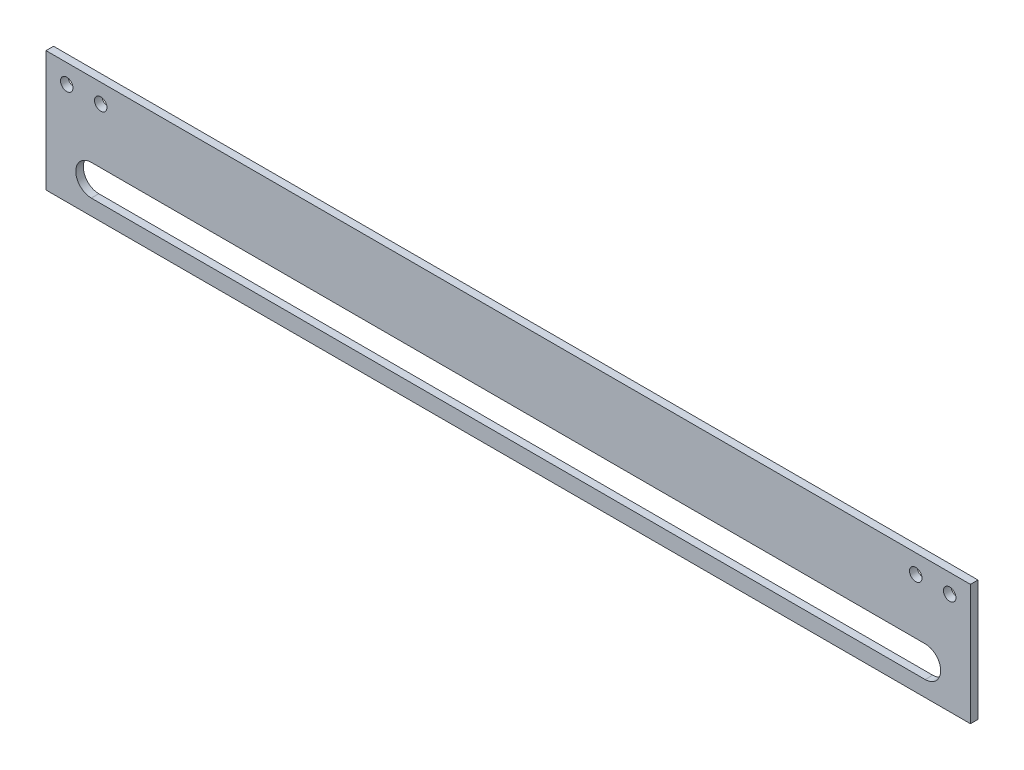
ISO-10303-21;
HEADER;
FILE_DESCRIPTION(('STEP AP214'),'2;1');
FILE_NAME('part.step','',(''),(''),'','','');
FILE_SCHEMA(('AUTOMOTIVE_DESIGN { 1 0 10303 214 1 1 1 1 }'));
ENDSEC;
DATA;
#1=APPLICATION_CONTEXT('core data for automotive mechanical design processes');
#2=APPLICATION_PROTOCOL_DEFINITION('international standard','automotive_design',2000,#1);
#3=PRODUCT_CONTEXT('',#1,'mechanical');
#4=PRODUCT('Part','Part','',(#3));
#5=PRODUCT_RELATED_PRODUCT_CATEGORY('part','',(#4));
#6=PRODUCT_DEFINITION_FORMATION('','',#4);
#7=PRODUCT_DEFINITION_CONTEXT('part definition',#1,'design');
#8=PRODUCT_DEFINITION('design','',#6,#7);
#9=PRODUCT_DEFINITION_SHAPE('','',#8);
#10=(LENGTH_UNIT() NAMED_UNIT(*) SI_UNIT(.MILLI.,.METRE.));
#11=(NAMED_UNIT(*) PLANE_ANGLE_UNIT() SI_UNIT($,.RADIAN.));
#12=(NAMED_UNIT(*) SI_UNIT($,.STERADIAN.) SOLID_ANGLE_UNIT());
#13=UNCERTAINTY_MEASURE_WITH_UNIT(LENGTH_MEASURE(1.E-05),#10,'distance_accuracy_value','');
#14=(GEOMETRIC_REPRESENTATION_CONTEXT(3) GLOBAL_UNCERTAINTY_ASSIGNED_CONTEXT((#13)) GLOBAL_UNIT_ASSIGNED_CONTEXT((#10,
#11,#12)) REPRESENTATION_CONTEXT('',''));
#15=CARTESIAN_POINT('',(0.,0.,0.));
#16=DIRECTION('',(0.,0.,1.));
#17=DIRECTION('',(1.,0.,0.));
#18=AXIS2_PLACEMENT_3D('',#15,#16,#17);
#19=CARTESIAN_POINT('',(0.,0.,2.));
#20=DIRECTION('',(0.,1.,0.));
#21=DIRECTION('',(-1.,0.,0.));
#22=AXIS2_PLACEMENT_3D('',#19,#20,#21);
#23=PLANE('',#22);
#24=DIRECTION('',(1.,0.,0.));
#25=VECTOR('',#24,1.);
#26=CARTESIAN_POINT('',(0.,0.,0.));
#27=LINE('',#26,#25);
#28=CARTESIAN_POINT('',(0.,0.,0.));
#29=VERTEX_POINT('',#28);
#30=CARTESIAN_POINT('',(245.,0.,0.));
#31=VERTEX_POINT('',#30);
#32=EDGE_CURVE('E157',#29,#31,#27,.T.);
#33=ORIENTED_EDGE('',*,*,#32,.T.);
#34=DIRECTION('',(0.,0.,-1.));
#35=VECTOR('',#34,1.);
#36=CARTESIAN_POINT('',(245.,0.,2.));
#37=LINE('',#36,#35);
#38=CARTESIAN_POINT('',(245.,0.,2.));
#39=VERTEX_POINT('',#38);
#40=EDGE_CURVE('E11',#39,#31,#37,.T.);
#41=ORIENTED_EDGE('',*,*,#40,.F.);
#42=DIRECTION('',(1.,0.,0.));
#43=VECTOR('',#42,1.);
#44=CARTESIAN_POINT('',(0.,0.,2.));
#45=LINE('',#44,#43);
#46=CARTESIAN_POINT('',(0.,0.,2.));
#47=VERTEX_POINT('',#46);
#48=EDGE_CURVE('E116',#47,#39,#45,.T.);
#49=ORIENTED_EDGE('',*,*,#48,.F.);
#50=DIRECTION('',(0.,0.,-1.));
#51=VECTOR('',#50,1.);
#52=CARTESIAN_POINT('',(0.,0.,2.));
#53=LINE('',#52,#51);
#54=EDGE_CURVE('E55',#47,#29,#53,.T.);
#55=ORIENTED_EDGE('',*,*,#54,.T.);
#56=EDGE_LOOP('',(#33,#41,#49,#55));
#57=FACE_BOUND('',#56,.T.);
#58=ADVANCED_FACE('F36',(#57),#23,.F.);
#59=CARTESIAN_POINT('',(245.,0.,2.));
#60=DIRECTION('',(-1.,0.,0.));
#61=DIRECTION('',(0.,0.,1.));
#62=AXIS2_PLACEMENT_3D('',#59,#60,#61);
#63=PLANE('',#62);
#64=DIRECTION('',(0.,1.,0.));
#65=VECTOR('',#64,1.);
#66=CARTESIAN_POINT('',(245.,0.,0.));
#67=LINE('',#66,#65);
#68=CARTESIAN_POINT('',(245.,32.,0.));
#69=VERTEX_POINT('',#68);
#70=EDGE_CURVE('E122',#31,#69,#67,.T.);
#71=ORIENTED_EDGE('',*,*,#70,.T.);
#72=DIRECTION('',(0.,0.,-1.));
#73=VECTOR('',#72,1.);
#74=CARTESIAN_POINT('',(245.,32.,2.));
#75=LINE('',#74,#73);
#76=CARTESIAN_POINT('',(245.,32.,2.));
#77=VERTEX_POINT('',#76);
#78=EDGE_CURVE('E46',#77,#69,#75,.T.);
#79=ORIENTED_EDGE('',*,*,#78,.F.);
#80=DIRECTION('',(0.,1.,0.));
#81=VECTOR('',#80,1.);
#82=CARTESIAN_POINT('',(245.,0.,2.));
#83=LINE('',#82,#81);
#84=EDGE_CURVE('E109',#39,#77,#83,.T.);
#85=ORIENTED_EDGE('',*,*,#84,.F.);
#86=ORIENTED_EDGE('',*,*,#40,.T.);
#87=EDGE_LOOP('',(#71,#79,#85,#86));
#88=FACE_BOUND('',#87,.T.);
#89=ADVANCED_FACE('F121',(#88),#63,.F.);
#90=CARTESIAN_POINT('',(0.,32.,2.));
#91=DIRECTION('',(0.,1.,0.));
#92=DIRECTION('',(0.,0.,1.));
#93=AXIS2_PLACEMENT_3D('',#90,#91,#92);
#94=PLANE('',#93);
#95=DIRECTION('',(1.,0.,0.));
#96=VECTOR('',#95,1.);
#97=CARTESIAN_POINT('',(0.,32.,0.));
#98=LINE('',#97,#96);
#99=CARTESIAN_POINT('',(0.,32.,0.));
#100=VERTEX_POINT('',#99);
#101=EDGE_CURVE('E160',#100,#69,#98,.T.);
#102=ORIENTED_EDGE('',*,*,#101,.F.);
#103=DIRECTION('',(0.,0.,-1.));
#104=VECTOR('',#103,1.);
#105=CARTESIAN_POINT('',(0.,32.,2.));
#106=LINE('',#105,#104);
#107=CARTESIAN_POINT('',(0.,32.,2.));
#108=VERTEX_POINT('',#107);
#109=EDGE_CURVE('E81',#108,#100,#106,.T.);
#110=ORIENTED_EDGE('',*,*,#109,.F.);
#111=DIRECTION('',(1.,0.,0.));
#112=VECTOR('',#111,1.);
#113=CARTESIAN_POINT('',(0.,32.,2.));
#114=LINE('',#113,#112);
#115=EDGE_CURVE('E115',#108,#77,#114,.T.);
#116=ORIENTED_EDGE('',*,*,#115,.T.);
#117=ORIENTED_EDGE('',*,*,#78,.T.);
#118=EDGE_LOOP('',(#102,#110,#116,#117));
#119=FACE_BOUND('',#118,.T.);
#120=ADVANCED_FACE('F126',(#119),#94,.T.);
#121=CARTESIAN_POINT('',(233.,8.25000000000003,2.));
#122=DIRECTION('',(0.,0.,-1.));
#123=DIRECTION('',(-1.,0.,0.));
#124=AXIS2_PLACEMENT_3D('',#121,#122,#123);
#125=CYLINDRICAL_SURFACE('',#124,4.1);
#126=CARTESIAN_POINT('',(233.,8.25000000000003,0.));
#127=DIRECTION('',(0.,0.,1.));
#128=DIRECTION('',(1.,0.,0.));
#129=AXIS2_PLACEMENT_3D('',#126,#127,#128);
#130=CIRCLE('',#129,4.1);
#131=CARTESIAN_POINT('',(233.,4.15000000000003,0.));
#132=VERTEX_POINT('',#131);
#133=CARTESIAN_POINT('',(233.,12.35,0.));
#134=VERTEX_POINT('',#133);
#135=EDGE_CURVE('E145',#132,#134,#130,.T.);
#136=ORIENTED_EDGE('',*,*,#135,.F.);
#137=DIRECTION('',(0.,0.,-1.));
#138=VECTOR('',#137,1.);
#139=CARTESIAN_POINT('',(233.,4.15000000000003,2.));
#140=LINE('',#139,#138);
#141=CARTESIAN_POINT('',(233.,4.15000000000003,2.));
#142=VERTEX_POINT('',#141);
#143=EDGE_CURVE('E40',#142,#132,#140,.T.);
#144=ORIENTED_EDGE('',*,*,#143,.F.);
#145=CARTESIAN_POINT('',(233.,8.25000000000003,2.));
#146=DIRECTION('',(0.,0.,1.));
#147=DIRECTION('',(1.,0.,0.));
#148=AXIS2_PLACEMENT_3D('',#145,#146,#147);
#149=CIRCLE('',#148,4.1);
#150=CARTESIAN_POINT('',(233.,12.35,2.));
#151=VERTEX_POINT('',#150);
#152=EDGE_CURVE('E199',#142,#151,#149,.T.);
#153=ORIENTED_EDGE('',*,*,#152,.T.);
#154=DIRECTION('',(0.,0.,-1.));
#155=VECTOR('',#154,1.);
#156=CARTESIAN_POINT('',(233.,12.35,2.));
#157=LINE('',#156,#155);
#158=EDGE_CURVE('E135',#151,#134,#157,.T.);
#159=ORIENTED_EDGE('',*,*,#158,.T.);
#160=EDGE_LOOP('',(#136,#144,#153,#159));
#161=FACE_BOUND('',#160,.T.);
#162=ADVANCED_FACE('F183',(#161),#125,.F.);
#163=CARTESIAN_POINT('',(0.,4.15,2.));
#164=DIRECTION('',(0.,1.,0.));
#165=DIRECTION('',(-1.,0.,0.));
#166=AXIS2_PLACEMENT_3D('',#163,#164,#165);
#167=PLANE('',#166);
#168=DIRECTION('',(1.,0.,0.));
#169=VECTOR('',#168,1.);
#170=CARTESIAN_POINT('',(0.,4.15,0.));
#171=LINE('',#170,#169);
#172=CARTESIAN_POINT('',(12.,4.15,0.));
#173=VERTEX_POINT('',#172);
#174=EDGE_CURVE('E148',#173,#132,#171,.T.);
#175=ORIENTED_EDGE('',*,*,#174,.F.);
#176=DIRECTION('',(0.,0.,-1.));
#177=VECTOR('',#176,1.);
#178=CARTESIAN_POINT('',(12.,4.15,2.));
#179=LINE('',#178,#177);
#180=CARTESIAN_POINT('',(12.,4.15,2.));
#181=VERTEX_POINT('',#180);
#182=EDGE_CURVE('E173',#181,#173,#179,.T.);
#183=ORIENTED_EDGE('',*,*,#182,.F.);
#184=DIRECTION('',(1.,0.,0.));
#185=VECTOR('',#184,1.);
#186=CARTESIAN_POINT('',(0.,4.15,2.));
#187=LINE('',#186,#185);
#188=EDGE_CURVE('E182',#181,#142,#187,.T.);
#189=ORIENTED_EDGE('',*,*,#188,.T.);
#190=ORIENTED_EDGE('',*,*,#143,.T.);
#191=EDGE_LOOP('',(#175,#183,#189,#190));
#192=FACE_BOUND('',#191,.T.);
#193=ADVANCED_FACE('F180',(#192),#167,.T.);
#194=CARTESIAN_POINT('',(12.,8.25,2.));
#195=DIRECTION('',(0.,0.,-1.));
#196=DIRECTION('',(-1.,0.,0.));
#197=AXIS2_PLACEMENT_3D('',#194,#195,#196);
#198=CYLINDRICAL_SURFACE('',#197,4.1);
#199=CARTESIAN_POINT('',(12.,8.25,0.));
#200=DIRECTION('',(0.,0.,1.));
#201=DIRECTION('',(1.,0.,0.));
#202=AXIS2_PLACEMENT_3D('',#199,#200,#201);
#203=CIRCLE('',#202,4.1);
#204=CARTESIAN_POINT('',(12.,12.35,0.));
#205=VERTEX_POINT('',#204);
#206=EDGE_CURVE('E151',#205,#173,#203,.T.);
#207=ORIENTED_EDGE('',*,*,#206,.F.);
#208=DIRECTION('',(0.,0.,-1.));
#209=VECTOR('',#208,1.);
#210=CARTESIAN_POINT('',(12.,12.35,2.));
#211=LINE('',#210,#209);
#212=CARTESIAN_POINT('',(12.,12.35,2.));
#213=VERTEX_POINT('',#212);
#214=EDGE_CURVE('E172',#213,#205,#211,.T.);
#215=ORIENTED_EDGE('',*,*,#214,.F.);
#216=CARTESIAN_POINT('',(12.,8.25,2.));
#217=DIRECTION('',(0.,0.,1.));
#218=DIRECTION('',(1.,0.,0.));
#219=AXIS2_PLACEMENT_3D('',#216,#217,#218);
#220=CIRCLE('',#219,4.1);
#221=EDGE_CURVE('E192',#213,#181,#220,.T.);
#222=ORIENTED_EDGE('',*,*,#221,.T.);
#223=ORIENTED_EDGE('',*,*,#182,.T.);
#224=EDGE_LOOP('',(#207,#215,#222,#223));
#225=FACE_BOUND('',#224,.T.);
#226=ADVANCED_FACE('F189',(#225),#198,.F.);
#227=CARTESIAN_POINT('',(0.,0.,2.));
#228=DIRECTION('',(-1.,0.,0.));
#229=DIRECTION('',(0.,0.,1.));
#230=AXIS2_PLACEMENT_3D('',#227,#228,#229);
#231=PLANE('',#230);
#232=DIRECTION('',(0.,1.,0.));
#233=VECTOR('',#232,1.);
#234=CARTESIAN_POINT('',(0.,0.,0.));
#235=LINE('',#234,#233);
#236=EDGE_CURVE('E162',#29,#100,#235,.T.);
#237=ORIENTED_EDGE('',*,*,#236,.F.);
#238=ORIENTED_EDGE('',*,*,#54,.F.);
#239=DIRECTION('',(0.,1.,0.));
#240=VECTOR('',#239,1.);
#241=CARTESIAN_POINT('',(0.,0.,2.));
#242=LINE('',#241,#240);
#243=EDGE_CURVE('E127',#47,#108,#242,.T.);
#244=ORIENTED_EDGE('',*,*,#243,.T.);
#245=ORIENTED_EDGE('',*,*,#109,.T.);
#246=EDGE_LOOP('',(#237,#238,#244,#245));
#247=FACE_BOUND('',#246,.T.);
#248=ADVANCED_FACE('F236',(#247),#231,.T.);
#249=CARTESIAN_POINT('',(0.,12.35,2.));
#250=DIRECTION('',(0.,1.,0.));
#251=DIRECTION('',(-1.,0.,0.));
#252=AXIS2_PLACEMENT_3D('',#249,#250,#251);
#253=PLANE('',#252);
#254=DIRECTION('',(1.,0.,0.));
#255=VECTOR('',#254,1.);
#256=CARTESIAN_POINT('',(0.,12.35,0.));
#257=LINE('',#256,#255);
#258=EDGE_CURVE('E154',#205,#134,#257,.T.);
#259=ORIENTED_EDGE('',*,*,#258,.T.);
#260=ORIENTED_EDGE('',*,*,#158,.F.);
#261=DIRECTION('',(1.,0.,0.));
#262=VECTOR('',#261,1.);
#263=CARTESIAN_POINT('',(0.,12.35,2.));
#264=LINE('',#263,#262);
#265=EDGE_CURVE('E194',#213,#151,#264,.T.);
#266=ORIENTED_EDGE('',*,*,#265,.F.);
#267=ORIENTED_EDGE('',*,*,#214,.T.);
#268=EDGE_LOOP('',(#259,#260,#266,#267));
#269=FACE_BOUND('',#268,.T.);
#270=ADVANCED_FACE('F195',(#269),#253,.F.);
#271=CARTESIAN_POINT('',(14.5,27.,2.));
#272=DIRECTION('',(0.,0.,-1.));
#273=DIRECTION('',(-1.,0.,0.));
#274=AXIS2_PLACEMENT_3D('',#271,#272,#273);
#275=CYLINDRICAL_SURFACE('',#274,1.65);
#276=CARTESIAN_POINT('',(14.5,27.,2.));
#277=DIRECTION('',(0.,0.,1.));
#278=DIRECTION('',(1.,0.,0.));
#279=AXIS2_PLACEMENT_3D('',#276,#277,#278);
#280=CIRCLE('',#279,1.65);
#281=CARTESIAN_POINT('',(16.15,27.,2.));
#282=VERTEX_POINT('',#281);
#283=EDGE_CURVE('E203',#282,#282,#280,.T.);
#284=ORIENTED_EDGE('',*,*,#283,.T.);
#285=EDGE_LOOP('',(#284));
#286=FACE_BOUND('',#285,.T.);
#287=CARTESIAN_POINT('',(14.5,27.,0.));
#288=DIRECTION('',(0.,0.,1.));
#289=DIRECTION('',(1.,0.,0.));
#290=AXIS2_PLACEMENT_3D('',#287,#288,#289);
#291=CIRCLE('',#290,1.65);
#292=CARTESIAN_POINT('',(16.15,27.,0.));
#293=VERTEX_POINT('',#292);
#294=EDGE_CURVE('E142',#293,#293,#291,.T.);
#295=ORIENTED_EDGE('',*,*,#294,.F.);
#296=EDGE_LOOP('',(#295));
#297=FACE_BOUND('',#296,.T.);
#298=ADVANCED_FACE('F227',(#286,#297),#275,.F.);
#299=CARTESIAN_POINT('',(5.5,27.,2.));
#300=DIRECTION('',(0.,0.,-1.));
#301=DIRECTION('',(-1.,0.,0.));
#302=AXIS2_PLACEMENT_3D('',#299,#300,#301);
#303=CYLINDRICAL_SURFACE('',#302,1.65);
#304=CARTESIAN_POINT('',(5.5,27.,2.));
#305=DIRECTION('',(0.,0.,1.));
#306=DIRECTION('',(1.,0.,0.));
#307=AXIS2_PLACEMENT_3D('',#304,#305,#306);
#308=CIRCLE('',#307,1.65);
#309=CARTESIAN_POINT('',(7.15,27.,2.));
#310=VERTEX_POINT('',#309);
#311=EDGE_CURVE('E206',#310,#310,#308,.T.);
#312=ORIENTED_EDGE('',*,*,#311,.T.);
#313=EDGE_LOOP('',(#312));
#314=FACE_BOUND('',#313,.T.);
#315=CARTESIAN_POINT('',(5.5,27.,0.));
#316=DIRECTION('',(0.,0.,1.));
#317=DIRECTION('',(1.,0.,0.));
#318=AXIS2_PLACEMENT_3D('',#315,#316,#317);
#319=CIRCLE('',#318,1.65);
#320=CARTESIAN_POINT('',(7.15,27.,0.));
#321=VERTEX_POINT('',#320);
#322=EDGE_CURVE('E139',#321,#321,#319,.T.);
#323=ORIENTED_EDGE('',*,*,#322,.F.);
#324=EDGE_LOOP('',(#323));
#325=FACE_BOUND('',#324,.T.);
#326=ADVANCED_FACE('F217',(#314,#325),#303,.F.);
#327=CARTESIAN_POINT('',(230.5,27.,2.));
#328=DIRECTION('',(0.,0.,-1.));
#329=DIRECTION('',(-1.,0.,0.));
#330=AXIS2_PLACEMENT_3D('',#327,#328,#329);
#331=CYLINDRICAL_SURFACE('',#330,1.65000000000002);
#332=CARTESIAN_POINT('',(230.5,27.,2.));
#333=DIRECTION('',(0.,0.,1.));
#334=DIRECTION('',(1.,0.,0.));
#335=AXIS2_PLACEMENT_3D('',#332,#333,#334);
#336=CIRCLE('',#335,1.65000000000002);
#337=CARTESIAN_POINT('',(232.15,27.,2.));
#338=VERTEX_POINT('',#337);
#339=EDGE_CURVE('E168',#338,#338,#336,.F.);
#340=ORIENTED_EDGE('',*,*,#339,.F.);
#341=EDGE_LOOP('',(#340));
#342=FACE_BOUND('',#341,.T.);
#343=CARTESIAN_POINT('',(230.5,27.,0.));
#344=DIRECTION('',(0.,0.,1.));
#345=DIRECTION('',(1.,0.,0.));
#346=AXIS2_PLACEMENT_3D('',#343,#344,#345);
#347=CIRCLE('',#346,1.65000000000002);
#348=CARTESIAN_POINT('',(232.15,27.,0.));
#349=VERTEX_POINT('',#348);
#350=EDGE_CURVE('E136',#349,#349,#347,.F.);
#351=ORIENTED_EDGE('',*,*,#350,.T.);
#352=EDGE_LOOP('',(#351));
#353=FACE_BOUND('',#352,.T.);
#354=ADVANCED_FACE('F38',(#342,#353),#331,.F.);
#355=CARTESIAN_POINT('',(239.5,27.,2.));
#356=DIRECTION('',(0.,0.,-1.));
#357=DIRECTION('',(-1.,0.,0.));
#358=AXIS2_PLACEMENT_3D('',#355,#356,#357);
#359=CYLINDRICAL_SURFACE('',#358,1.64999999999999);
#360=CARTESIAN_POINT('',(239.5,27.,2.));
#361=DIRECTION('',(0.,0.,1.));
#362=DIRECTION('',(1.,0.,0.));
#363=AXIS2_PLACEMENT_3D('',#360,#361,#362);
#364=CIRCLE('',#363,1.64999999999999);
#365=CARTESIAN_POINT('',(241.15,27.,2.));
#366=VERTEX_POINT('',#365);
#367=EDGE_CURVE('E129',#366,#366,#364,.F.);
#368=ORIENTED_EDGE('',*,*,#367,.F.);
#369=EDGE_LOOP('',(#368));
#370=FACE_BOUND('',#369,.T.);
#371=CARTESIAN_POINT('',(239.5,27.,0.));
#372=DIRECTION('',(0.,0.,1.));
#373=DIRECTION('',(1.,0.,0.));
#374=AXIS2_PLACEMENT_3D('',#371,#372,#373);
#375=CIRCLE('',#374,1.64999999999999);
#376=CARTESIAN_POINT('',(241.15,27.,0.));
#377=VERTEX_POINT('',#376);
#378=EDGE_CURVE('E165',#377,#377,#375,.F.);
#379=ORIENTED_EDGE('',*,*,#378,.T.);
#380=EDGE_LOOP('',(#379));
#381=FACE_BOUND('',#380,.T.);
#382=ADVANCED_FACE('F216',(#370,#381),#359,.F.);
#383=CARTESIAN_POINT('',(0.,0.,2.));
#384=DIRECTION('',(0.,0.,1.));
#385=DIRECTION('',(1.,0.,0.));
#386=AXIS2_PLACEMENT_3D('',#383,#384,#385);
#387=PLANE('',#386);
#388=ORIENTED_EDGE('',*,*,#339,.T.);
#389=EDGE_LOOP('',(#388));
#390=FACE_BOUND('',#389,.T.);
#391=ORIENTED_EDGE('',*,*,#311,.F.);
#392=EDGE_LOOP('',(#391));
#393=FACE_BOUND('',#392,.T.);
#394=ORIENTED_EDGE('',*,*,#283,.F.);
#395=EDGE_LOOP('',(#394));
#396=FACE_BOUND('',#395,.T.);
#397=ORIENTED_EDGE('',*,*,#152,.F.);
#398=ORIENTED_EDGE('',*,*,#188,.F.);
#399=ORIENTED_EDGE('',*,*,#221,.F.);
#400=ORIENTED_EDGE('',*,*,#265,.T.);
#401=EDGE_LOOP('',(#397,#398,#399,#400));
#402=FACE_BOUND('',#401,.T.);
#403=ORIENTED_EDGE('',*,*,#48,.T.);
#404=ORIENTED_EDGE('',*,*,#84,.T.);
#405=ORIENTED_EDGE('',*,*,#115,.F.);
#406=ORIENTED_EDGE('',*,*,#243,.F.);
#407=EDGE_LOOP('',(#403,#404,#405,#406));
#408=FACE_BOUND('',#407,.T.);
#409=ORIENTED_EDGE('',*,*,#367,.T.);
#410=EDGE_LOOP('',(#409));
#411=FACE_BOUND('',#410,.T.);
#412=ADVANCED_FACE('F111',(#390,#393,#396,#402,#408,#411),#387,.T.);
#413=CARTESIAN_POINT('',(0.,0.,0.));
#414=DIRECTION('',(0.,0.,1.));
#415=DIRECTION('',(1.,0.,0.));
#416=AXIS2_PLACEMENT_3D('',#413,#414,#415);
#417=PLANE('',#416);
#418=ORIENTED_EDGE('',*,*,#350,.F.);
#419=EDGE_LOOP('',(#418));
#420=FACE_BOUND('',#419,.T.);
#421=ORIENTED_EDGE('',*,*,#322,.T.);
#422=EDGE_LOOP('',(#421));
#423=FACE_BOUND('',#422,.T.);
#424=ORIENTED_EDGE('',*,*,#294,.T.);
#425=EDGE_LOOP('',(#424));
#426=FACE_BOUND('',#425,.T.);
#427=ORIENTED_EDGE('',*,*,#135,.T.);
#428=ORIENTED_EDGE('',*,*,#258,.F.);
#429=ORIENTED_EDGE('',*,*,#206,.T.);
#430=ORIENTED_EDGE('',*,*,#174,.T.);
#431=EDGE_LOOP('',(#427,#428,#429,#430));
#432=FACE_BOUND('',#431,.T.);
#433=ORIENTED_EDGE('',*,*,#32,.F.);
#434=ORIENTED_EDGE('',*,*,#236,.T.);
#435=ORIENTED_EDGE('',*,*,#101,.T.);
#436=ORIENTED_EDGE('',*,*,#70,.F.);
#437=EDGE_LOOP('',(#433,#434,#435,#436));
#438=FACE_BOUND('',#437,.T.);
#439=ORIENTED_EDGE('',*,*,#378,.F.);
#440=EDGE_LOOP('',(#439));
#441=FACE_BOUND('',#440,.T.);
#442=ADVANCED_FACE('F187',(#420,#423,#426,#432,#438,#441),#417,.F.);
#443=CLOSED_SHELL('',(#58,#89,#120,#162,#193,#226,#248,#270,#298,#326,#354,#382,#412,#442));
#444=MANIFOLD_SOLID_BREP('B2',#443);
#445=ADVANCED_BREP_SHAPE_REPRESENTATION('',(#18,#444),#14);
#446=SHAPE_DEFINITION_REPRESENTATION(#9,#445);
ENDSEC;
END-ISO-10303-21;
